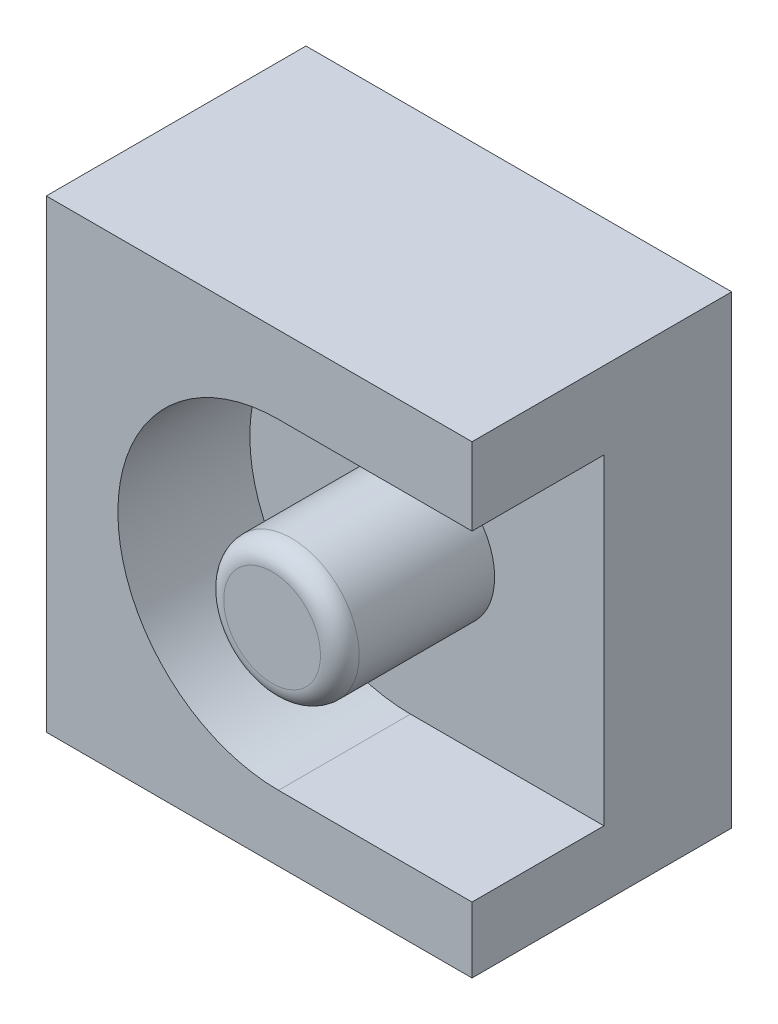
ISO-10303-21;
HEADER;
FILE_DESCRIPTION(('STEP AP214'),'2;1');
FILE_NAME('part.step','',(''),(''),'','','');
FILE_SCHEMA(('AUTOMOTIVE_DESIGN { 1 0 10303 214 1 1 1 1 }'));
ENDSEC;
DATA;
#1=APPLICATION_CONTEXT('core data for automotive mechanical design processes');
#2=APPLICATION_PROTOCOL_DEFINITION('international standard','automotive_design',2000,#1);
#3=PRODUCT_CONTEXT('',#1,'mechanical');
#4=PRODUCT('Part','Part','',(#3));
#5=PRODUCT_RELATED_PRODUCT_CATEGORY('part','',(#4));
#6=PRODUCT_DEFINITION_FORMATION('','',#4);
#7=PRODUCT_DEFINITION_CONTEXT('part definition',#1,'design');
#8=PRODUCT_DEFINITION('design','',#6,#7);
#9=PRODUCT_DEFINITION_SHAPE('','',#8);
#10=(LENGTH_UNIT() NAMED_UNIT(*) SI_UNIT(.MILLI.,.METRE.));
#11=(NAMED_UNIT(*) PLANE_ANGLE_UNIT() SI_UNIT($,.RADIAN.));
#12=(NAMED_UNIT(*) SI_UNIT($,.STERADIAN.) SOLID_ANGLE_UNIT());
#13=UNCERTAINTY_MEASURE_WITH_UNIT(LENGTH_MEASURE(1.E-05),#10,'distance_accuracy_value','');
#14=(GEOMETRIC_REPRESENTATION_CONTEXT(3) GLOBAL_UNCERTAINTY_ASSIGNED_CONTEXT((#13)) GLOBAL_UNIT_ASSIGNED_CONTEXT((#10,
#11,#12)) REPRESENTATION_CONTEXT('',''));
#15=CARTESIAN_POINT('',(0.,0.,0.));
#16=DIRECTION('',(0.,0.,1.));
#17=DIRECTION('',(1.,0.,0.));
#18=AXIS2_PLACEMENT_3D('',#15,#16,#17);
#19=CARTESIAN_POINT('',(87.5,-5.,5.01000000000001));
#20=DIRECTION('',(-1.,0.,0.));
#21=DIRECTION('',(0.,-1.,0.));
#22=AXIS2_PLACEMENT_3D('',#19,#20,#21);
#23=PLANE('',#22);
#24=DIRECTION('',(0.,-1.,0.));
#25=VECTOR('',#24,1.);
#26=CARTESIAN_POINT('',(87.5,10.,-5.));
#27=LINE('',#26,#25);
#28=CARTESIAN_POINT('',(87.5,11.,-5.));
#29=VERTEX_POINT('',#28);
#30=CARTESIAN_POINT('',(87.5,-0.999999999999999,-5.));
#31=VERTEX_POINT('',#30);
#32=EDGE_CURVE('E49',#29,#31,#27,.T.);
#33=ORIENTED_EDGE('',*,*,#32,.T.);
#34=DIRECTION('',(0.,0.,-1.));
#35=VECTOR('',#34,1.);
#36=CARTESIAN_POINT('',(87.5,-1.,-5.));
#37=LINE('',#36,#35);
#38=CARTESIAN_POINT('',(87.5,-1.,1.70967856950185));
#39=VERTEX_POINT('',#38);
#40=EDGE_CURVE('E145',#39,#31,#37,.T.);
#41=ORIENTED_EDGE('',*,*,#40,.F.);
#42=DIRECTION('',(0.,-1.,0.));
#43=VECTOR('',#42,1.);
#44=CARTESIAN_POINT('',(87.5,-1.,1.70967856950185));
#45=LINE('',#44,#43);
#46=CARTESIAN_POINT('',(87.5,11.,1.70967856950185));
#47=VERTEX_POINT('',#46);
#48=EDGE_CURVE('E146',#47,#39,#45,.T.);
#49=ORIENTED_EDGE('',*,*,#48,.F.);
#50=DIRECTION('',(0.,0.,1.));
#51=VECTOR('',#50,1.);
#52=CARTESIAN_POINT('',(87.5,11.,-5.));
#53=LINE('',#52,#51);
#54=EDGE_CURVE('E141',#29,#47,#53,.T.);
#55=ORIENTED_EDGE('',*,*,#54,.F.);
#56=EDGE_LOOP('',(#33,#41,#49,#55));
#57=FACE_BOUND('',#56,.T.);
#58=ADVANCED_FACE('F45',(#57),#23,.T.);
#59=CARTESIAN_POINT('',(93.925,4.85,2.29999999999998));
#60=DIRECTION('',(0.,0.,1.));
#61=DIRECTION('',(1.,0.,0.));
#62=AXIS2_PLACEMENT_3D('',#59,#60,#61);
#63=PLANE('',#62);
#64=CARTESIAN_POINT('',(93.925,4.85,2.29999999999998));
#65=DIRECTION('',(0.,0.,1.));
#66=DIRECTION('',(1.,0.,0.));
#67=AXIS2_PLACEMENT_3D('',#64,#65,#66);
#68=CIRCLE('',#67,1.25000000000001);
#69=CARTESIAN_POINT('',(95.175,4.85,2.29999999999998));
#70=VERTEX_POINT('',#69);
#71=EDGE_CURVE('E179',#70,#70,#68,.T.);
#72=ORIENTED_EDGE('',*,*,#71,.T.);
#73=EDGE_LOOP('',(#72));
#74=FACE_BOUND('',#73,.T.);
#75=ADVANCED_FACE('F233',(#74),#63,.T.);
#76=CARTESIAN_POINT('',(93.925,4.85,1.79999999999998));
#77=DIRECTION('',(0.,0.,1.));
#78=DIRECTION('',(1.,0.,0.));
#79=AXIS2_PLACEMENT_3D('',#76,#77,#78);
#80=TOROIDAL_SURFACE('',#79,1.25000000000001,0.5);
#81=CARTESIAN_POINT('',(93.925,4.85,1.79999999999998));
#82=DIRECTION('',(0.,0.,1.));
#83=DIRECTION('',(1.,0.,0.));
#84=AXIS2_PLACEMENT_3D('',#81,#82,#83);
#85=CIRCLE('',#84,1.75000000000001);
#86=CARTESIAN_POINT('',(95.675,4.85,1.79999999999998));
#87=VERTEX_POINT('',#86);
#88=EDGE_CURVE('E187',#87,#87,#85,.F.);
#89=ORIENTED_EDGE('',*,*,#88,.F.);
#90=EDGE_LOOP('',(#89));
#91=FACE_BOUND('',#90,.T.);
#92=ORIENTED_EDGE('',*,*,#71,.F.);
#93=EDGE_LOOP('',(#92));
#94=FACE_BOUND('',#93,.T.);
#95=ADVANCED_FACE('F230',(#91,#94),#80,.T.);
#96=CARTESIAN_POINT('',(93.925,4.85,2.29999999999998));
#97=DIRECTION('',(0.,0.,-1.));
#98=DIRECTION('',(-1.,0.,0.));
#99=AXIS2_PLACEMENT_3D('',#96,#97,#98);
#100=CYLINDRICAL_SURFACE('',#99,1.75000000000001);
#101=ORIENTED_EDGE('',*,*,#88,.T.);
#102=EDGE_LOOP('',(#101));
#103=FACE_BOUND('',#102,.T.);
#104=CARTESIAN_POINT('',(93.925,4.85,-1.70000000000002));
#105=DIRECTION('',(0.,0.,1.));
#106=DIRECTION('',(1.,0.,0.));
#107=AXIS2_PLACEMENT_3D('',#104,#105,#106);
#108=CIRCLE('',#107,1.75000000000001);
#109=CARTESIAN_POINT('',(95.675,4.85,-1.70000000000002));
#110=VERTEX_POINT('',#109);
#111=EDGE_CURVE('E11',#110,#110,#108,.T.);
#112=ORIENTED_EDGE('',*,*,#111,.T.);
#113=EDGE_LOOP('',(#112));
#114=FACE_BOUND('',#113,.T.);
#115=ADVANCED_FACE('F227',(#103,#114),#100,.T.);
#116=CARTESIAN_POINT('',(93.5,4.85,-1.70000000000002));
#117=DIRECTION('',(0.,0.,1.));
#118=DIRECTION('',(1.,0.,0.));
#119=AXIS2_PLACEMENT_3D('',#116,#117,#118);
#120=PLANE('',#119);
#121=ORIENTED_EDGE('',*,*,#111,.F.);
#122=EDGE_LOOP('',(#121));
#123=FACE_BOUND('',#122,.T.);
#124=CARTESIAN_POINT('',(93.5,4.85,-1.70000000000002));
#125=DIRECTION('',(0.,0.,1.));
#126=DIRECTION('',(1.,0.,0.));
#127=AXIS2_PLACEMENT_3D('',#124,#125,#126);
#128=CIRCLE('',#127,4.15);
#129=CARTESIAN_POINT('',(93.5,9.,-1.70000000000002));
#130=VERTEX_POINT('',#129);
#131=CARTESIAN_POINT('',(93.5,0.699999999999997,-1.70000000000002));
#132=VERTEX_POINT('',#131);
#133=EDGE_CURVE('E55',#130,#132,#128,.T.);
#134=ORIENTED_EDGE('',*,*,#133,.T.);
#135=DIRECTION('',(1.,0.,0.));
#136=VECTOR('',#135,1.);
#137=CARTESIAN_POINT('',(98.5,0.699999999999999,-1.70000000000002));
#138=LINE('',#137,#136);
#139=CARTESIAN_POINT('',(98.5,0.699999999999996,-1.70000000000002));
#140=VERTEX_POINT('',#139);
#141=EDGE_CURVE('E113',#132,#140,#138,.T.);
#142=ORIENTED_EDGE('',*,*,#141,.T.);
#143=DIRECTION('',(0.,1.,0.));
#144=VECTOR('',#143,1.);
#145=CARTESIAN_POINT('',(98.5,9.,-1.70000000000002));
#146=LINE('',#145,#144);
#147=CARTESIAN_POINT('',(98.5,9.,-1.70000000000002));
#148=VERTEX_POINT('',#147);
#149=EDGE_CURVE('E71',#140,#148,#146,.T.);
#150=ORIENTED_EDGE('',*,*,#149,.T.);
#151=DIRECTION('',(-1.,0.,0.));
#152=VECTOR('',#151,1.);
#153=CARTESIAN_POINT('',(93.5,9.,-1.70000000000002));
#154=LINE('',#153,#152);
#155=EDGE_CURVE('E133',#148,#130,#154,.T.);
#156=ORIENTED_EDGE('',*,*,#155,.T.);
#157=EDGE_LOOP('',(#134,#142,#150,#156));
#158=FACE_BOUND('',#157,.T.);
#159=ADVANCED_FACE('F115',(#123,#158),#120,.T.);
#160=CARTESIAN_POINT('',(87.5,10.,-5.));
#161=DIRECTION('',(0.,0.,1.));
#162=DIRECTION('',(1.,0.,0.));
#163=AXIS2_PLACEMENT_3D('',#160,#161,#162);
#164=PLANE('',#163);
#165=ORIENTED_EDGE('',*,*,#32,.F.);
#166=DIRECTION('',(-1.,0.,0.));
#167=VECTOR('',#166,1.);
#168=CARTESIAN_POINT('',(98.5,11.,-5.));
#169=LINE('',#168,#167);
#170=CARTESIAN_POINT('',(98.5,11.,-5.));
#171=VERTEX_POINT('',#170);
#172=EDGE_CURVE('E184',#171,#29,#169,.T.);
#173=ORIENTED_EDGE('',*,*,#172,.F.);
#174=DIRECTION('',(0.,1.,0.));
#175=VECTOR('',#174,1.);
#176=CARTESIAN_POINT('',(98.5,-1.,-5.));
#177=LINE('',#176,#175);
#178=CARTESIAN_POINT('',(98.5,-1.,-5.));
#179=VERTEX_POINT('',#178);
#180=EDGE_CURVE('E207',#179,#171,#177,.T.);
#181=ORIENTED_EDGE('',*,*,#180,.F.);
#182=DIRECTION('',(-1.,0.,0.));
#183=VECTOR('',#182,1.);
#184=CARTESIAN_POINT('',(98.5,-1.,-5.));
#185=LINE('',#184,#183);
#186=EDGE_CURVE('E178',#179,#31,#185,.T.);
#187=ORIENTED_EDGE('',*,*,#186,.T.);
#188=EDGE_LOOP('',(#165,#173,#181,#187));
#189=FACE_BOUND('',#188,.T.);
#190=ADVANCED_FACE('F47',(#189),#164,.F.);
#191=CARTESIAN_POINT('',(98.5,0.699999999999999,-1.70000000000002));
#192=DIRECTION('',(0.,-1.,0.));
#193=DIRECTION('',(1.,0.,0.));
#194=AXIS2_PLACEMENT_3D('',#191,#192,#193);
#195=PLANE('',#194);
#196=DIRECTION('',(0.,0.,1.));
#197=VECTOR('',#196,1.);
#198=CARTESIAN_POINT('',(98.5,0.699999999999999,-1.70000000000002));
#199=LINE('',#198,#197);
#200=CARTESIAN_POINT('',(98.5,0.699999999999999,1.70967856950185));
#201=VERTEX_POINT('',#200);
#202=EDGE_CURVE('E120',#140,#201,#199,.T.);
#203=ORIENTED_EDGE('',*,*,#202,.F.);
#204=ORIENTED_EDGE('',*,*,#141,.F.);
#205=DIRECTION('',(0.,0.,1.));
#206=VECTOR('',#205,1.);
#207=CARTESIAN_POINT('',(93.5,0.699999999999997,-1.70000000000002));
#208=LINE('',#207,#206);
#209=CARTESIAN_POINT('',(93.5,0.699999999999997,1.70967856950185));
#210=VERTEX_POINT('',#209);
#211=EDGE_CURVE('E63',#132,#210,#208,.T.);
#212=ORIENTED_EDGE('',*,*,#211,.T.);
#213=DIRECTION('',(-1.,0.,0.));
#214=VECTOR('',#213,1.);
#215=CARTESIAN_POINT('',(98.5,0.699999999999999,1.70967856950185));
#216=LINE('',#215,#214);
#217=EDGE_CURVE('E123',#201,#210,#216,.T.);
#218=ORIENTED_EDGE('',*,*,#217,.F.);
#219=EDGE_LOOP('',(#203,#204,#212,#218));
#220=FACE_BOUND('',#219,.T.);
#221=ADVANCED_FACE('F121',(#220),#195,.F.);
#222=CARTESIAN_POINT('',(98.5,-1.,-5.));
#223=DIRECTION('',(0.,1.,0.));
#224=DIRECTION('',(0.,0.,1.));
#225=AXIS2_PLACEMENT_3D('',#222,#223,#224);
#226=PLANE('',#225);
#227=ORIENTED_EDGE('',*,*,#40,.T.);
#228=ORIENTED_EDGE('',*,*,#186,.F.);
#229=DIRECTION('',(0.,0.,-1.));
#230=VECTOR('',#229,1.);
#231=CARTESIAN_POINT('',(98.5,-1.,-5.));
#232=LINE('',#231,#230);
#233=CARTESIAN_POINT('',(98.5,-1.,1.70967856950185));
#234=VERTEX_POINT('',#233);
#235=EDGE_CURVE('E148',#234,#179,#232,.T.);
#236=ORIENTED_EDGE('',*,*,#235,.F.);
#237=DIRECTION('',(-1.,0.,0.));
#238=VECTOR('',#237,1.);
#239=CARTESIAN_POINT('',(98.5,-1.,1.70967856950185));
#240=LINE('',#239,#238);
#241=EDGE_CURVE('E198',#234,#39,#240,.T.);
#242=ORIENTED_EDGE('',*,*,#241,.T.);
#243=EDGE_LOOP('',(#227,#228,#236,#242));
#244=FACE_BOUND('',#243,.T.);
#245=ADVANCED_FACE('F214',(#244),#226,.F.);
#246=CARTESIAN_POINT('',(98.5,11.,-5.));
#247=DIRECTION('',(0.,-1.,0.));
#248=DIRECTION('',(0.,0.,-1.));
#249=AXIS2_PLACEMENT_3D('',#246,#247,#248);
#250=PLANE('',#249);
#251=ORIENTED_EDGE('',*,*,#172,.T.);
#252=ORIENTED_EDGE('',*,*,#54,.T.);
#253=DIRECTION('',(-1.,0.,0.));
#254=VECTOR('',#253,1.);
#255=CARTESIAN_POINT('',(98.5,11.,1.70967856950185));
#256=LINE('',#255,#254);
#257=CARTESIAN_POINT('',(98.5,11.,1.70967856950185));
#258=VERTEX_POINT('',#257);
#259=EDGE_CURVE('E194',#258,#47,#256,.T.);
#260=ORIENTED_EDGE('',*,*,#259,.F.);
#261=DIRECTION('',(0.,0.,1.));
#262=VECTOR('',#261,1.);
#263=CARTESIAN_POINT('',(98.5,11.,-5.));
#264=LINE('',#263,#262);
#265=EDGE_CURVE('E205',#171,#258,#264,.T.);
#266=ORIENTED_EDGE('',*,*,#265,.F.);
#267=EDGE_LOOP('',(#251,#252,#260,#266));
#268=FACE_BOUND('',#267,.T.);
#269=ADVANCED_FACE('F220',(#268),#250,.F.);
#270=CARTESIAN_POINT('',(98.5,0.,0.));
#271=DIRECTION('',(-1.,0.,0.));
#272=DIRECTION('',(0.,0.,1.));
#273=AXIS2_PLACEMENT_3D('',#270,#271,#272);
#274=PLANE('',#273);
#275=DIRECTION('',(0.,-1.,0.));
#276=VECTOR('',#275,1.);
#277=CARTESIAN_POINT('',(98.5,-1.,1.70967856950185));
#278=LINE('',#277,#276);
#279=CARTESIAN_POINT('',(98.5,9.,1.70967856950185));
#280=VERTEX_POINT('',#279);
#281=EDGE_CURVE('E201',#258,#280,#278,.T.);
#282=ORIENTED_EDGE('',*,*,#281,.T.);
#283=DIRECTION('',(0.,0.,1.));
#284=VECTOR('',#283,1.);
#285=CARTESIAN_POINT('',(98.5,9.,-1.70000000000002));
#286=LINE('',#285,#284);
#287=EDGE_CURVE('E127',#148,#280,#286,.T.);
#288=ORIENTED_EDGE('',*,*,#287,.F.);
#289=ORIENTED_EDGE('',*,*,#149,.F.);
#290=ORIENTED_EDGE('',*,*,#202,.T.);
#291=EDGE_CURVE('E204',#201,#234,#278,.T.);
#292=ORIENTED_EDGE('',*,*,#291,.T.);
#293=ORIENTED_EDGE('',*,*,#235,.T.);
#294=ORIENTED_EDGE('',*,*,#180,.T.);
#295=ORIENTED_EDGE('',*,*,#265,.T.);
#296=EDGE_LOOP('',(#282,#288,#289,#290,#292,#293,#294,#295));
#297=FACE_BOUND('',#296,.T.);
#298=ADVANCED_FACE('F131',(#297),#274,.F.);
#299=CARTESIAN_POINT('',(93.5,9.,-1.70000000000002));
#300=DIRECTION('',(0.,1.,0.));
#301=DIRECTION('',(0.,0.,1.));
#302=AXIS2_PLACEMENT_3D('',#299,#300,#301);
#303=PLANE('',#302);
#304=DIRECTION('',(0.,0.,1.));
#305=VECTOR('',#304,1.);
#306=CARTESIAN_POINT('',(93.5,9.,-1.70000000000002));
#307=LINE('',#306,#305);
#308=CARTESIAN_POINT('',(93.5,9.,1.70967856950185));
#309=VERTEX_POINT('',#308);
#310=EDGE_CURVE('E163',#130,#309,#307,.T.);
#311=ORIENTED_EDGE('',*,*,#310,.F.);
#312=ORIENTED_EDGE('',*,*,#155,.F.);
#313=ORIENTED_EDGE('',*,*,#287,.T.);
#314=DIRECTION('',(1.,0.,0.));
#315=VECTOR('',#314,1.);
#316=CARTESIAN_POINT('',(98.5,9.,1.70967856950185));
#317=LINE('',#316,#315);
#318=EDGE_CURVE('E150',#309,#280,#317,.T.);
#319=ORIENTED_EDGE('',*,*,#318,.F.);
#320=EDGE_LOOP('',(#311,#312,#313,#319));
#321=FACE_BOUND('',#320,.T.);
#322=ADVANCED_FACE('F248',(#321),#303,.F.);
#323=CARTESIAN_POINT('',(93.5,4.85,-1.70000000000002));
#324=DIRECTION('',(0.,0.,1.));
#325=DIRECTION('',(1.,0.,0.));
#326=AXIS2_PLACEMENT_3D('',#323,#324,#325);
#327=CYLINDRICAL_SURFACE('',#326,4.15);
#328=ORIENTED_EDGE('',*,*,#211,.F.);
#329=ORIENTED_EDGE('',*,*,#133,.F.);
#330=ORIENTED_EDGE('',*,*,#310,.T.);
#331=CARTESIAN_POINT('',(93.5,4.85,1.70967856950185));
#332=DIRECTION('',(0.,0.,-1.));
#333=DIRECTION('',(-1.,0.,0.));
#334=AXIS2_PLACEMENT_3D('',#331,#332,#333);
#335=CIRCLE('',#334,4.15);
#336=EDGE_CURVE('E174',#210,#309,#335,.T.);
#337=ORIENTED_EDGE('',*,*,#336,.F.);
#338=EDGE_LOOP('',(#328,#329,#330,#337));
#339=FACE_BOUND('',#338,.T.);
#340=ADVANCED_FACE('F173',(#339),#327,.F.);
#341=CARTESIAN_POINT('',(98.5,-1.,1.70967856950185));
#342=DIRECTION('',(0.,0.,-1.));
#343=DIRECTION('',(-1.,0.,0.));
#344=AXIS2_PLACEMENT_3D('',#341,#342,#343);
#345=PLANE('',#344);
#346=ORIENTED_EDGE('',*,*,#336,.T.);
#347=ORIENTED_EDGE('',*,*,#318,.T.);
#348=ORIENTED_EDGE('',*,*,#281,.F.);
#349=ORIENTED_EDGE('',*,*,#259,.T.);
#350=ORIENTED_EDGE('',*,*,#48,.T.);
#351=ORIENTED_EDGE('',*,*,#241,.F.);
#352=ORIENTED_EDGE('',*,*,#291,.F.);
#353=ORIENTED_EDGE('',*,*,#217,.T.);
#354=EDGE_LOOP('',(#346,#347,#348,#349,#350,#351,#352,#353));
#355=FACE_BOUND('',#354,.T.);
#356=ADVANCED_FACE('F176',(#355),#345,.F.);
#357=CLOSED_SHELL('',(#58,#75,#95,#115,#159,#190,#221,#245,#269,#298,#322,#340,#356));
#358=MANIFOLD_SOLID_BREP('B2',#357);
#359=ADVANCED_BREP_SHAPE_REPRESENTATION('',(#18,#358),#14);
#360=SHAPE_DEFINITION_REPRESENTATION(#9,#359);
ENDSEC;
END-ISO-10303-21;
